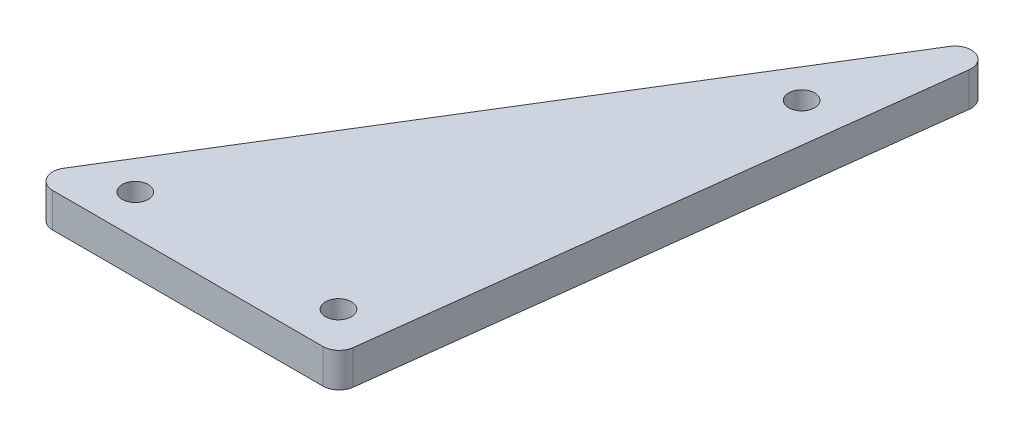
ISO-10303-21;
HEADER;
FILE_DESCRIPTION(('STEP AP214'),'2;1');
FILE_NAME('part.step','',(''),(''),'','','');
FILE_SCHEMA(('AUTOMOTIVE_DESIGN { 1 0 10303 214 1 1 1 1 }'));
ENDSEC;
DATA;
#1=APPLICATION_CONTEXT('core data for automotive mechanical design processes');
#2=APPLICATION_PROTOCOL_DEFINITION('international standard','automotive_design',2000,#1);
#3=PRODUCT_CONTEXT('',#1,'mechanical');
#4=PRODUCT('Part','Part','',(#3));
#5=PRODUCT_RELATED_PRODUCT_CATEGORY('part','',(#4));
#6=PRODUCT_DEFINITION_FORMATION('','',#4);
#7=PRODUCT_DEFINITION_CONTEXT('part definition',#1,'design');
#8=PRODUCT_DEFINITION('design','',#6,#7);
#9=PRODUCT_DEFINITION_SHAPE('','',#8);
#10=(LENGTH_UNIT() NAMED_UNIT(*) SI_UNIT(.MILLI.,.METRE.));
#11=(NAMED_UNIT(*) PLANE_ANGLE_UNIT() SI_UNIT($,.RADIAN.));
#12=(NAMED_UNIT(*) SI_UNIT($,.STERADIAN.) SOLID_ANGLE_UNIT());
#13=UNCERTAINTY_MEASURE_WITH_UNIT(LENGTH_MEASURE(1.E-05),#10,'distance_accuracy_value','');
#14=(GEOMETRIC_REPRESENTATION_CONTEXT(3) GLOBAL_UNCERTAINTY_ASSIGNED_CONTEXT((#13)) GLOBAL_UNIT_ASSIGNED_CONTEXT((#10,
#11,#12)) REPRESENTATION_CONTEXT('',''));
#15=CARTESIAN_POINT('',(0.,0.,0.));
#16=DIRECTION('',(0.,0.,1.));
#17=DIRECTION('',(1.,0.,0.));
#18=AXIS2_PLACEMENT_3D('',#15,#16,#17);
#19=CARTESIAN_POINT('',(55.3458242063322,6.35,-3.));
#20=DIRECTION('',(0.,-1.,0.));
#21=DIRECTION('',(0.,0.,-1.));
#22=AXIS2_PLACEMENT_3D('',#19,#20,#21);
#23=CYLINDRICAL_SURFACE('',#22,3.);
#24=CARTESIAN_POINT('',(55.3458242063322,0.,-3.));
#25=DIRECTION('',(0.,1.,0.));
#26=DIRECTION('',(0.,0.,1.));
#27=AXIS2_PLACEMENT_3D('',#24,#25,#26);
#28=CIRCLE('',#27,3.);
#29=CARTESIAN_POINT('',(55.3458242063322,0.,0.));
#30=VERTEX_POINT('',#29);
#31=CARTESIAN_POINT('',(58.3234626612561,0.,-2.63439196978457));
#32=VERTEX_POINT('',#31);
#33=EDGE_CURVE('E121',#30,#32,#28,.T.);
#34=ORIENTED_EDGE('',*,*,#33,.T.);
#35=DIRECTION('',(0.,-1.,0.));
#36=VECTOR('',#35,1.);
#37=CARTESIAN_POINT('',(58.3234626612561,6.35,-2.63439196978457));
#38=LINE('',#37,#36);
#39=CARTESIAN_POINT('',(58.3234626612561,6.35,-2.63439196978457));
#40=VERTEX_POINT('',#39);
#41=EDGE_CURVE('E11',#40,#32,#38,.T.);
#42=ORIENTED_EDGE('',*,*,#41,.F.);
#43=CARTESIAN_POINT('',(55.3458242063322,6.35,-3.));
#44=DIRECTION('',(0.,1.,0.));
#45=DIRECTION('',(0.,0.,1.));
#46=AXIS2_PLACEMENT_3D('',#43,#44,#45);
#47=CIRCLE('',#46,3.);
#48=CARTESIAN_POINT('',(55.3458242063322,6.35,0.));
#49=VERTEX_POINT('',#48);
#50=EDGE_CURVE('E132',#49,#40,#47,.T.);
#51=ORIENTED_EDGE('',*,*,#50,.F.);
#52=DIRECTION('',(0.,-1.,0.));
#53=VECTOR('',#52,1.);
#54=CARTESIAN_POINT('',(55.3458242063322,6.35,0.));
#55=LINE('',#54,#53);
#56=EDGE_CURVE('E117',#49,#30,#55,.T.);
#57=ORIENTED_EDGE('',*,*,#56,.T.);
#58=EDGE_LOOP('',(#34,#42,#51,#57));
#59=FACE_BOUND('',#58,.T.);
#60=ADVANCED_FACE('F37',(#59),#23,.T.);
#61=CARTESIAN_POINT('',(58.3234626612561,6.35,-2.63439196978457));
#62=DIRECTION('',(-0.992546151641322,0.,-0.121869343405144));
#63=DIRECTION('',(-0.121869343405144,0.,0.992546151641322));
#64=AXIS2_PLACEMENT_3D('',#61,#62,#63);
#65=PLANE('',#64);
#66=DIRECTION('',(0.121869343405144,0.,-0.992546151641323));
#67=VECTOR('',#66,1.);
#68=CARTESIAN_POINT('',(58.3234626612561,0.,-2.63439196978457));
#69=LINE('',#68,#67);
#70=CARTESIAN_POINT('',(70.7823264510929,0.,-104.103694773167));
#71=VERTEX_POINT('',#70);
#72=EDGE_CURVE('E124',#32,#71,#69,.T.);
#73=ORIENTED_EDGE('',*,*,#72,.T.);
#74=DIRECTION('',(0.,-1.,0.));
#75=VECTOR('',#74,1.);
#76=CARTESIAN_POINT('',(70.7823264510929,6.35,-104.103694773167));
#77=LINE('',#76,#75);
#78=CARTESIAN_POINT('',(70.7823264510929,6.35,-104.103694773167));
#79=VERTEX_POINT('',#78);
#80=EDGE_CURVE('E45',#79,#71,#77,.T.);
#81=ORIENTED_EDGE('',*,*,#80,.F.);
#82=DIRECTION('',(0.121869343405144,0.,-0.992546151641323));
#83=VECTOR('',#82,1.);
#84=CARTESIAN_POINT('',(58.3234626612561,6.35,-2.63439196978457));
#85=LINE('',#84,#83);
#86=EDGE_CURVE('E90',#40,#79,#85,.T.);
#87=ORIENTED_EDGE('',*,*,#86,.F.);
#88=ORIENTED_EDGE('',*,*,#41,.T.);
#89=EDGE_LOOP('',(#73,#81,#87,#88));
#90=FACE_BOUND('',#89,.T.);
#91=ADVANCED_FACE('F157',(#90),#65,.F.);
#92=CARTESIAN_POINT('',(67.804687996169,6.35,-104.469302803382));
#93=DIRECTION('',(0.,-1.,0.));
#94=DIRECTION('',(0.,0.,-1.));
#95=AXIS2_PLACEMENT_3D('',#92,#93,#94);
#96=CYLINDRICAL_SURFACE('',#95,3.);
#97=CARTESIAN_POINT('',(67.804687996169,0.,-104.469302803382));
#98=DIRECTION('',(0.,1.,0.));
#99=DIRECTION('',(0.,0.,1.));
#100=AXIS2_PLACEMENT_3D('',#97,#98,#99);
#101=CIRCLE('',#100,3.);
#102=CARTESIAN_POINT('',(65.2496414956756,0.,-106.041478805081));
#103=VERTEX_POINT('',#102);
#104=EDGE_CURVE('E127',#71,#103,#101,.T.);
#105=ORIENTED_EDGE('',*,*,#104,.T.);
#106=DIRECTION('',(0.,-1.,0.));
#107=VECTOR('',#106,1.);
#108=CARTESIAN_POINT('',(65.2496414956756,6.35,-106.041478805081));
#109=LINE('',#108,#107);
#110=CARTESIAN_POINT('',(65.2496414956756,6.35,-106.041478805081));
#111=VERTEX_POINT('',#110);
#112=EDGE_CURVE('E112',#111,#103,#109,.T.);
#113=ORIENTED_EDGE('',*,*,#112,.F.);
#114=CARTESIAN_POINT('',(67.804687996169,6.35,-104.469302803382));
#115=DIRECTION('',(0.,1.,0.));
#116=DIRECTION('',(0.,0.,1.));
#117=AXIS2_PLACEMENT_3D('',#114,#115,#116);
#118=CIRCLE('',#117,3.);
#119=EDGE_CURVE('E103',#79,#111,#118,.T.);
#120=ORIENTED_EDGE('',*,*,#119,.F.);
#121=ORIENTED_EDGE('',*,*,#80,.T.);
#122=EDGE_LOOP('',(#105,#113,#120,#121));
#123=FACE_BOUND('',#122,.T.);
#124=ADVANCED_FACE('F138',(#123),#96,.T.);
#125=CARTESIAN_POINT('',(65.2496414956756,6.35,-106.041478805081));
#126=DIRECTION('',(0.851682166831112,0.,0.524058667232841));
#127=DIRECTION('',(0.524058667232841,0.,-0.851682166831112));
#128=AXIS2_PLACEMENT_3D('',#125,#126,#127);
#129=PLANE('',#128);
#130=DIRECTION('',(-0.524058667232841,0.,0.851682166831112));
#131=VECTOR('',#130,1.);
#132=CARTESIAN_POINT('',(65.2496414956756,0.,-106.041478805081));
#133=LINE('',#132,#131);
#134=CARTESIAN_POINT('',(2.81335990715803,0.,-4.57217600169856));
#135=VERTEX_POINT('',#134);
#136=EDGE_CURVE('E111',#103,#135,#133,.T.);
#137=ORIENTED_EDGE('',*,*,#136,.T.);
#138=DIRECTION('',(0.,-1.,0.));
#139=VECTOR('',#138,1.);
#140=CARTESIAN_POINT('',(2.81335990715803,6.35,-4.57217600169856));
#141=LINE('',#140,#139);
#142=CARTESIAN_POINT('',(2.81335990715803,6.35,-4.57217600169856));
#143=VERTEX_POINT('',#142);
#144=EDGE_CURVE('E108',#143,#135,#141,.T.);
#145=ORIENTED_EDGE('',*,*,#144,.F.);
#146=DIRECTION('',(-0.524058667232841,0.,0.851682166831112));
#147=VECTOR('',#146,1.);
#148=CARTESIAN_POINT('',(65.2496414956756,6.35,-106.041478805081));
#149=LINE('',#148,#147);
#150=EDGE_CURVE('E97',#111,#143,#149,.T.);
#151=ORIENTED_EDGE('',*,*,#150,.F.);
#152=ORIENTED_EDGE('',*,*,#112,.T.);
#153=EDGE_LOOP('',(#137,#145,#151,#152));
#154=FACE_BOUND('',#153,.T.);
#155=ADVANCED_FACE('F109',(#154),#129,.F.);
#156=CARTESIAN_POINT('',(5.36840640765135,6.35,-3.));
#157=DIRECTION('',(0.,-1.,0.));
#158=DIRECTION('',(0.,0.,-1.));
#159=AXIS2_PLACEMENT_3D('',#156,#157,#158);
#160=CYLINDRICAL_SURFACE('',#159,3.);
#161=CARTESIAN_POINT('',(5.36840640765135,0.,-3.));
#162=DIRECTION('',(0.,1.,0.));
#163=DIRECTION('',(0.,0.,-1.));
#164=AXIS2_PLACEMENT_3D('',#161,#162,#163);
#165=CIRCLE('',#164,3.);
#166=CARTESIAN_POINT('',(5.36840640765139,0.,0.));
#167=VERTEX_POINT('',#166);
#168=EDGE_CURVE('E76',#135,#167,#165,.T.);
#169=ORIENTED_EDGE('',*,*,#168,.T.);
#170=DIRECTION('',(0.,-1.,0.));
#171=VECTOR('',#170,1.);
#172=CARTESIAN_POINT('',(5.36840640765139,6.35,0.));
#173=LINE('',#172,#171);
#174=CARTESIAN_POINT('',(5.36840640765139,6.35,0.));
#175=VERTEX_POINT('',#174);
#176=EDGE_CURVE('E113',#175,#167,#173,.T.);
#177=ORIENTED_EDGE('',*,*,#176,.F.);
#178=CARTESIAN_POINT('',(5.36840640765135,6.35,-3.));
#179=DIRECTION('',(0.,1.,0.));
#180=DIRECTION('',(0.,0.,-1.));
#181=AXIS2_PLACEMENT_3D('',#178,#179,#180);
#182=CIRCLE('',#181,3.);
#183=EDGE_CURVE('E101',#143,#175,#182,.T.);
#184=ORIENTED_EDGE('',*,*,#183,.F.);
#185=ORIENTED_EDGE('',*,*,#144,.T.);
#186=EDGE_LOOP('',(#169,#177,#184,#185));
#187=FACE_BOUND('',#186,.T.);
#188=ADVANCED_FACE('F115',(#187),#160,.T.);
#189=CARTESIAN_POINT('',(5.36840640765139,6.35,0.));
#190=DIRECTION('',(0.,0.,-1.));
#191=DIRECTION('',(-1.,0.,0.));
#192=AXIS2_PLACEMENT_3D('',#189,#190,#191);
#193=PLANE('',#192);
#194=DIRECTION('',(1.,0.,0.));
#195=VECTOR('',#194,1.);
#196=CARTESIAN_POINT('',(5.36840640765139,0.,0.));
#197=LINE('',#196,#195);
#198=EDGE_CURVE('E82',#167,#30,#197,.T.);
#199=ORIENTED_EDGE('',*,*,#198,.T.);
#200=ORIENTED_EDGE('',*,*,#56,.F.);
#201=DIRECTION('',(1.,0.,0.));
#202=VECTOR('',#201,1.);
#203=CARTESIAN_POINT('',(5.36840640765139,6.35,0.));
#204=LINE('',#203,#202);
#205=EDGE_CURVE('E53',#175,#49,#204,.T.);
#206=ORIENTED_EDGE('',*,*,#205,.F.);
#207=ORIENTED_EDGE('',*,*,#176,.T.);
#208=EDGE_LOOP('',(#199,#200,#206,#207));
#209=FACE_BOUND('',#208,.T.);
#210=ADVANCED_FACE('F145',(#209),#193,.F.);
#211=CARTESIAN_POINT('',(55.3458242063322,6.35,-3.));
#212=DIRECTION('',(0.,1.,0.));
#213=DIRECTION('',(0.,0.,1.));
#214=AXIS2_PLACEMENT_3D('',#211,#212,#213);
#215=PLANE('',#214);
#216=CARTESIAN_POINT('',(60.1907906000938,6.35,-83.6997313703742));
#217=DIRECTION('',(0.,1.,0.));
#218=DIRECTION('',(0.,0.,1.));
#219=AXIS2_PLACEMENT_3D('',#216,#217,#218);
#220=CIRCLE('',#219,2.40000000000001);
#221=CARTESIAN_POINT('',(60.1907906000938,6.35,-81.2997313703742));
#222=VERTEX_POINT('',#221);
#223=EDGE_CURVE('E232',#222,#222,#220,.T.);
#224=ORIENTED_EDGE('',*,*,#223,.F.);
#225=EDGE_LOOP('',(#224));
#226=FACE_BOUND('',#225,.T.);
#227=CARTESIAN_POINT('',(13.2404945734913,6.35,-7.4));
#228=DIRECTION('',(0.,1.,0.));
#229=DIRECTION('',(0.,0.,1.));
#230=AXIS2_PLACEMENT_3D('',#227,#228,#229);
#231=CIRCLE('',#230,2.4);
#232=CARTESIAN_POINT('',(13.2404945734913,6.35,-5.00000000000001));
#233=VERTEX_POINT('',#232);
#234=EDGE_CURVE('E237',#233,#233,#231,.T.);
#235=ORIENTED_EDGE('',*,*,#234,.F.);
#236=EDGE_LOOP('',(#235));
#237=FACE_BOUND('',#236,.T.);
#238=CARTESIAN_POINT('',(50.8223615867731,6.35,-7.4));
#239=DIRECTION('',(0.,1.,0.));
#240=DIRECTION('',(0.,0.,1.));
#241=AXIS2_PLACEMENT_3D('',#238,#239,#240);
#242=CIRCLE('',#241,2.4);
#243=CARTESIAN_POINT('',(50.8223615867731,6.35,-5.));
#244=VERTEX_POINT('',#243);
#245=EDGE_CURVE('E245',#244,#244,#242,.T.);
#246=ORIENTED_EDGE('',*,*,#245,.F.);
#247=EDGE_LOOP('',(#246));
#248=FACE_BOUND('',#247,.T.);
#249=ORIENTED_EDGE('',*,*,#50,.T.);
#250=ORIENTED_EDGE('',*,*,#86,.T.);
#251=ORIENTED_EDGE('',*,*,#119,.T.);
#252=ORIENTED_EDGE('',*,*,#150,.T.);
#253=ORIENTED_EDGE('',*,*,#183,.T.);
#254=ORIENTED_EDGE('',*,*,#205,.T.);
#255=EDGE_LOOP('',(#249,#250,#251,#252,#253,#254));
#256=FACE_BOUND('',#255,.T.);
#257=ADVANCED_FACE('F99',(#226,#237,#248,#256),#215,.T.);
#258=CARTESIAN_POINT('',(55.3458242063322,0.,-3.));
#259=DIRECTION('',(0.,1.,0.));
#260=DIRECTION('',(0.,0.,1.));
#261=AXIS2_PLACEMENT_3D('',#258,#259,#260);
#262=PLANE('',#261);
#263=CARTESIAN_POINT('',(60.1907906000938,0.,-83.6997313703742));
#264=DIRECTION('',(0.,1.,0.));
#265=DIRECTION('',(0.,0.,1.));
#266=AXIS2_PLACEMENT_3D('',#263,#264,#265);
#267=CIRCLE('',#266,2.40000000000001);
#268=CARTESIAN_POINT('',(60.1907906000938,0.,-81.2997313703742));
#269=VERTEX_POINT('',#268);
#270=EDGE_CURVE('E125',#269,#269,#267,.T.);
#271=ORIENTED_EDGE('',*,*,#270,.T.);
#272=EDGE_LOOP('',(#271));
#273=FACE_BOUND('',#272,.T.);
#274=CARTESIAN_POINT('',(13.2404945734913,0.,-7.4));
#275=DIRECTION('',(0.,1.,0.));
#276=DIRECTION('',(0.,0.,1.));
#277=AXIS2_PLACEMENT_3D('',#274,#275,#276);
#278=CIRCLE('',#277,2.4);
#279=CARTESIAN_POINT('',(13.2404945734913,0.,-5.00000000000001));
#280=VERTEX_POINT('',#279);
#281=EDGE_CURVE('E233',#280,#280,#278,.T.);
#282=ORIENTED_EDGE('',*,*,#281,.T.);
#283=EDGE_LOOP('',(#282));
#284=FACE_BOUND('',#283,.T.);
#285=CARTESIAN_POINT('',(50.8223615867731,0.,-7.4));
#286=DIRECTION('',(0.,1.,0.));
#287=DIRECTION('',(0.,0.,1.));
#288=AXIS2_PLACEMENT_3D('',#285,#286,#287);
#289=CIRCLE('',#288,2.4);
#290=CARTESIAN_POINT('',(50.8223615867731,0.,-5.));
#291=VERTEX_POINT('',#290);
#292=EDGE_CURVE('E242',#291,#291,#289,.T.);
#293=ORIENTED_EDGE('',*,*,#292,.T.);
#294=EDGE_LOOP('',(#293));
#295=FACE_BOUND('',#294,.T.);
#296=ORIENTED_EDGE('',*,*,#33,.F.);
#297=ORIENTED_EDGE('',*,*,#198,.F.);
#298=ORIENTED_EDGE('',*,*,#168,.F.);
#299=ORIENTED_EDGE('',*,*,#136,.F.);
#300=ORIENTED_EDGE('',*,*,#104,.F.);
#301=ORIENTED_EDGE('',*,*,#72,.F.);
#302=EDGE_LOOP('',(#296,#297,#298,#299,#300,#301));
#303=FACE_BOUND('',#302,.T.);
#304=ADVANCED_FACE('F141',(#273,#284,#295,#303),#262,.F.);
#305=CARTESIAN_POINT('',(50.8223615867731,0.,-7.4));
#306=DIRECTION('',(0.,1.,0.));
#307=DIRECTION('',(0.,0.,1.));
#308=AXIS2_PLACEMENT_3D('',#305,#306,#307);
#309=CYLINDRICAL_SURFACE('',#308,2.4);
#310=ORIENTED_EDGE('',*,*,#292,.F.);
#311=EDGE_LOOP('',(#310));
#312=FACE_BOUND('',#311,.T.);
#313=ORIENTED_EDGE('',*,*,#245,.T.);
#314=EDGE_LOOP('',(#313));
#315=FACE_BOUND('',#314,.T.);
#316=ADVANCED_FACE('F194',(#312,#315),#309,.F.);
#317=CARTESIAN_POINT('',(13.2404945734913,0.,-7.4));
#318=DIRECTION('',(0.,1.,0.));
#319=DIRECTION('',(0.,0.,1.));
#320=AXIS2_PLACEMENT_3D('',#317,#318,#319);
#321=CYLINDRICAL_SURFACE('',#320,2.4);
#322=ORIENTED_EDGE('',*,*,#281,.F.);
#323=EDGE_LOOP('',(#322));
#324=FACE_BOUND('',#323,.T.);
#325=ORIENTED_EDGE('',*,*,#234,.T.);
#326=EDGE_LOOP('',(#325));
#327=FACE_BOUND('',#326,.T.);
#328=ADVANCED_FACE('F203',(#324,#327),#321,.F.);
#329=CARTESIAN_POINT('',(60.1907906000938,0.,-83.6997313703742));
#330=DIRECTION('',(0.,1.,0.));
#331=DIRECTION('',(0.,0.,1.));
#332=AXIS2_PLACEMENT_3D('',#329,#330,#331);
#333=CYLINDRICAL_SURFACE('',#332,2.40000000000001);
#334=ORIENTED_EDGE('',*,*,#270,.F.);
#335=EDGE_LOOP('',(#334));
#336=FACE_BOUND('',#335,.T.);
#337=ORIENTED_EDGE('',*,*,#223,.T.);
#338=EDGE_LOOP('',(#337));
#339=FACE_BOUND('',#338,.T.);
#340=ADVANCED_FACE('F213',(#336,#339),#333,.F.);
#341=CLOSED_SHELL('',(#60,#91,#124,#155,#188,#210,#257,#304,#316,#328,#340));
#342=MANIFOLD_SOLID_BREP('B2',#341);
#343=ADVANCED_BREP_SHAPE_REPRESENTATION('',(#18,#342),#14);
#344=SHAPE_DEFINITION_REPRESENTATION(#9,#343);
ENDSEC;
END-ISO-10303-21;
